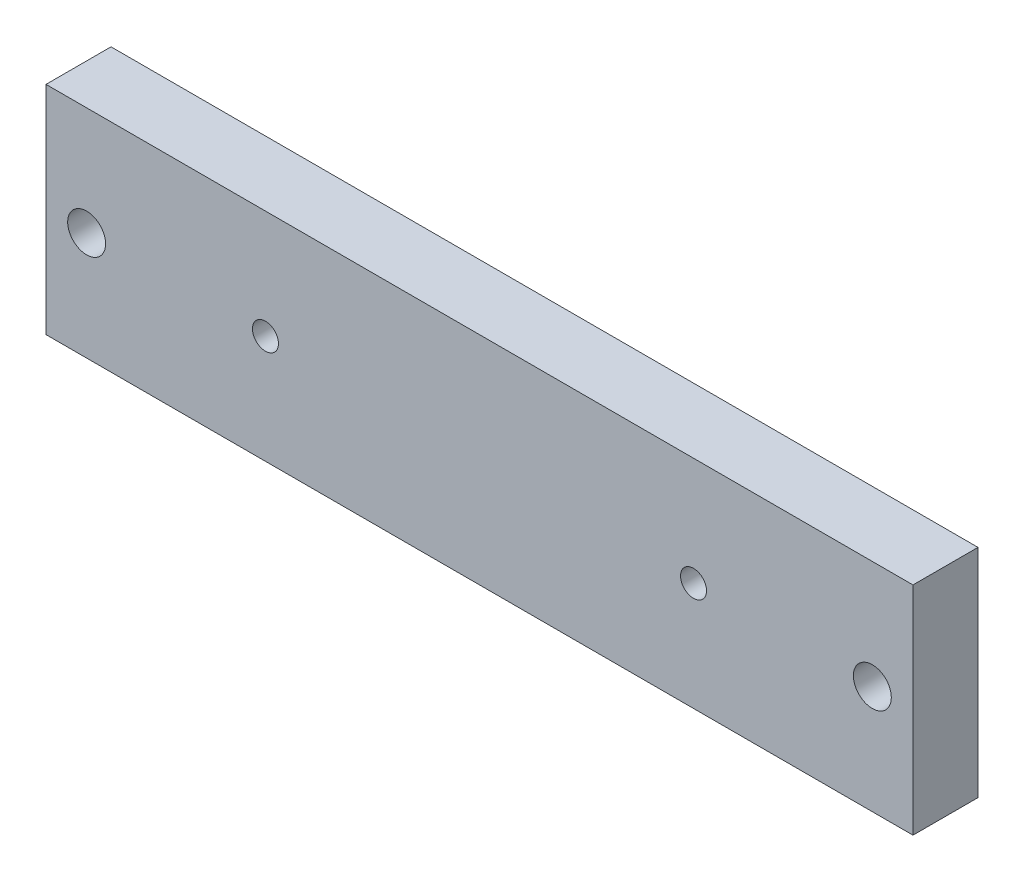
ISO-10303-21;
HEADER;
FILE_DESCRIPTION(('STEP AP214'),'2;1');
FILE_NAME('part.step','',(''),(''),'','','');
FILE_SCHEMA(('AUTOMOTIVE_DESIGN { 1 0 10303 214 1 1 1 1 }'));
ENDSEC;
DATA;
#1=APPLICATION_CONTEXT('core data for automotive mechanical design processes');
#2=APPLICATION_PROTOCOL_DEFINITION('international standard','automotive_design',2000,#1);
#3=PRODUCT_CONTEXT('',#1,'mechanical');
#4=PRODUCT('Part','Part','',(#3));
#5=PRODUCT_RELATED_PRODUCT_CATEGORY('part','',(#4));
#6=PRODUCT_DEFINITION_FORMATION('','',#4);
#7=PRODUCT_DEFINITION_CONTEXT('part definition',#1,'design');
#8=PRODUCT_DEFINITION('design','',#6,#7);
#9=PRODUCT_DEFINITION_SHAPE('','',#8);
#10=(LENGTH_UNIT() NAMED_UNIT(*) SI_UNIT(.MILLI.,.METRE.));
#11=(NAMED_UNIT(*) PLANE_ANGLE_UNIT() SI_UNIT($,.RADIAN.));
#12=(NAMED_UNIT(*) SI_UNIT($,.STERADIAN.) SOLID_ANGLE_UNIT());
#13=UNCERTAINTY_MEASURE_WITH_UNIT(LENGTH_MEASURE(1.E-05),#10,'distance_accuracy_value','');
#14=(GEOMETRIC_REPRESENTATION_CONTEXT(3) GLOBAL_UNCERTAINTY_ASSIGNED_CONTEXT((#13)) GLOBAL_UNIT_ASSIGNED_CONTEXT((#10,
#11,#12)) REPRESENTATION_CONTEXT('',''));
#15=CARTESIAN_POINT('',(0.,0.,0.));
#16=DIRECTION('',(0.,0.,1.));
#17=DIRECTION('',(1.,0.,0.));
#18=AXIS2_PLACEMENT_3D('',#15,#16,#17);
#19=CARTESIAN_POINT('',(80.,20.,12.));
#20=DIRECTION('',(-1.,0.,0.));
#21=DIRECTION('',(0.,0.,1.));
#22=AXIS2_PLACEMENT_3D('',#19,#20,#21);
#23=PLANE('',#22);
#24=DIRECTION('',(0.,1.,0.));
#25=VECTOR('',#24,1.);
#26=CARTESIAN_POINT('',(80.,20.,0.));
#27=LINE('',#26,#25);
#28=CARTESIAN_POINT('',(80.,-20.,0.));
#29=VERTEX_POINT('',#28);
#30=CARTESIAN_POINT('',(80.,20.,0.));
#31=VERTEX_POINT('',#30);
#32=EDGE_CURVE('E96',#29,#31,#27,.T.);
#33=ORIENTED_EDGE('',*,*,#32,.T.);
#34=DIRECTION('',(0.,0.,-1.));
#35=VECTOR('',#34,1.);
#36=CARTESIAN_POINT('',(80.,20.,12.));
#37=LINE('',#36,#35);
#38=CARTESIAN_POINT('',(80.,20.,12.));
#39=VERTEX_POINT('',#38);
#40=EDGE_CURVE('E11',#39,#31,#37,.T.);
#41=ORIENTED_EDGE('',*,*,#40,.F.);
#42=DIRECTION('',(0.,1.,0.));
#43=VECTOR('',#42,1.);
#44=CARTESIAN_POINT('',(80.,20.,12.));
#45=LINE('',#44,#43);
#46=CARTESIAN_POINT('',(80.,-20.,12.));
#47=VERTEX_POINT('',#46);
#48=EDGE_CURVE('E84',#47,#39,#45,.T.);
#49=ORIENTED_EDGE('',*,*,#48,.F.);
#50=DIRECTION('',(0.,0.,-1.));
#51=VECTOR('',#50,1.);
#52=CARTESIAN_POINT('',(80.,-20.,12.));
#53=LINE('',#52,#51);
#54=EDGE_CURVE('E92',#47,#29,#53,.T.);
#55=ORIENTED_EDGE('',*,*,#54,.T.);
#56=EDGE_LOOP('',(#33,#41,#49,#55));
#57=FACE_BOUND('',#56,.T.);
#58=ADVANCED_FACE('F33',(#57),#23,.F.);
#59=CARTESIAN_POINT('',(-80.,20.,12.));
#60=DIRECTION('',(0.,-1.,0.));
#61=DIRECTION('',(0.,0.,-1.));
#62=AXIS2_PLACEMENT_3D('',#59,#60,#61);
#63=PLANE('',#62);
#64=DIRECTION('',(-1.,0.,0.));
#65=VECTOR('',#64,1.);
#66=CARTESIAN_POINT('',(-80.,20.,0.));
#67=LINE('',#66,#65);
#68=CARTESIAN_POINT('',(-80.,20.,0.));
#69=VERTEX_POINT('',#68);
#70=EDGE_CURVE('E88',#31,#69,#67,.T.);
#71=ORIENTED_EDGE('',*,*,#70,.T.);
#72=DIRECTION('',(0.,0.,-1.));
#73=VECTOR('',#72,1.);
#74=CARTESIAN_POINT('',(-80.,20.,12.));
#75=LINE('',#74,#73);
#76=CARTESIAN_POINT('',(-80.,20.,12.));
#77=VERTEX_POINT('',#76);
#78=EDGE_CURVE('E41',#77,#69,#75,.T.);
#79=ORIENTED_EDGE('',*,*,#78,.F.);
#80=DIRECTION('',(-1.,0.,0.));
#81=VECTOR('',#80,1.);
#82=CARTESIAN_POINT('',(-80.,20.,12.));
#83=LINE('',#82,#81);
#84=EDGE_CURVE('E79',#39,#77,#83,.T.);
#85=ORIENTED_EDGE('',*,*,#84,.F.);
#86=ORIENTED_EDGE('',*,*,#40,.T.);
#87=EDGE_LOOP('',(#71,#79,#85,#86));
#88=FACE_BOUND('',#87,.T.);
#89=ADVANCED_FACE('F87',(#88),#63,.F.);
#90=CARTESIAN_POINT('',(-80.,20.,12.));
#91=DIRECTION('',(1.,0.,0.));
#92=DIRECTION('',(0.,0.,-1.));
#93=AXIS2_PLACEMENT_3D('',#90,#91,#92);
#94=PLANE('',#93);
#95=DIRECTION('',(0.,-1.,0.));
#96=VECTOR('',#95,1.);
#97=CARTESIAN_POINT('',(-80.,20.,0.));
#98=LINE('',#97,#96);
#99=CARTESIAN_POINT('',(-80.,-20.,0.));
#100=VERTEX_POINT('',#99);
#101=EDGE_CURVE('E66',#69,#100,#98,.T.);
#102=ORIENTED_EDGE('',*,*,#101,.T.);
#103=DIRECTION('',(0.,0.,-1.));
#104=VECTOR('',#103,1.);
#105=CARTESIAN_POINT('',(-80.,-20.,12.));
#106=LINE('',#105,#104);
#107=CARTESIAN_POINT('',(-80.,-20.,12.));
#108=VERTEX_POINT('',#107);
#109=EDGE_CURVE('E89',#108,#100,#106,.T.);
#110=ORIENTED_EDGE('',*,*,#109,.F.);
#111=DIRECTION('',(0.,-1.,0.));
#112=VECTOR('',#111,1.);
#113=CARTESIAN_POINT('',(-80.,20.,12.));
#114=LINE('',#113,#112);
#115=EDGE_CURVE('E82',#77,#108,#114,.T.);
#116=ORIENTED_EDGE('',*,*,#115,.F.);
#117=ORIENTED_EDGE('',*,*,#78,.T.);
#118=EDGE_LOOP('',(#102,#110,#116,#117));
#119=FACE_BOUND('',#118,.T.);
#120=ADVANCED_FACE('F90',(#119),#94,.F.);
#121=CARTESIAN_POINT('',(-80.,-20.,12.));
#122=DIRECTION('',(0.,1.,0.));
#123=DIRECTION('',(0.,0.,1.));
#124=AXIS2_PLACEMENT_3D('',#121,#122,#123);
#125=PLANE('',#124);
#126=DIRECTION('',(1.,0.,0.));
#127=VECTOR('',#126,1.);
#128=CARTESIAN_POINT('',(-80.,-20.,0.));
#129=LINE('',#128,#127);
#130=EDGE_CURVE('E72',#100,#29,#129,.T.);
#131=ORIENTED_EDGE('',*,*,#130,.T.);
#132=ORIENTED_EDGE('',*,*,#54,.F.);
#133=DIRECTION('',(1.,0.,0.));
#134=VECTOR('',#133,1.);
#135=CARTESIAN_POINT('',(-80.,-20.,12.));
#136=LINE('',#135,#134);
#137=EDGE_CURVE('E49',#108,#47,#136,.T.);
#138=ORIENTED_EDGE('',*,*,#137,.F.);
#139=ORIENTED_EDGE('',*,*,#109,.T.);
#140=EDGE_LOOP('',(#131,#132,#138,#139));
#141=FACE_BOUND('',#140,.T.);
#142=ADVANCED_FACE('F104',(#141),#125,.F.);
#143=CARTESIAN_POINT('',(0.,0.,12.));
#144=DIRECTION('',(0.,0.,1.));
#145=DIRECTION('',(1.,0.,0.));
#146=AXIS2_PLACEMENT_3D('',#143,#144,#145);
#147=PLANE('',#146);
#148=CARTESIAN_POINT('',(39.5,0.,12.));
#149=DIRECTION('',(0.,0.,-1.));
#150=DIRECTION('',(-1.,0.,0.));
#151=AXIS2_PLACEMENT_3D('',#148,#149,#150);
#152=CIRCLE('',#151,2.4);
#153=CARTESIAN_POINT('',(37.1,0.,12.));
#154=VERTEX_POINT('',#153);
#155=EDGE_CURVE('E133',#154,#154,#152,.T.);
#156=ORIENTED_EDGE('',*,*,#155,.T.);
#157=EDGE_LOOP('',(#156));
#158=FACE_BOUND('',#157,.T.);
#159=CARTESIAN_POINT('',(-39.5,0.,12.));
#160=DIRECTION('',(0.,0.,-1.));
#161=DIRECTION('',(-1.,0.,0.));
#162=AXIS2_PLACEMENT_3D('',#159,#160,#161);
#163=CIRCLE('',#162,2.4);
#164=CARTESIAN_POINT('',(-41.9,0.,12.));
#165=VERTEX_POINT('',#164);
#166=EDGE_CURVE('E121',#165,#165,#163,.T.);
#167=ORIENTED_EDGE('',*,*,#166,.T.);
#168=EDGE_LOOP('',(#167));
#169=FACE_BOUND('',#168,.T.);
#170=CARTESIAN_POINT('',(-72.5,0.,12.));
#171=DIRECTION('',(0.,0.,1.));
#172=DIRECTION('',(1.,0.,0.));
#173=AXIS2_PLACEMENT_3D('',#170,#171,#172);
#174=CIRCLE('',#173,3.49999999999999);
#175=CARTESIAN_POINT('',(-69.,0.,12.));
#176=VERTEX_POINT('',#175);
#177=EDGE_CURVE('E118',#176,#176,#174,.T.);
#178=ORIENTED_EDGE('',*,*,#177,.F.);
#179=EDGE_LOOP('',(#178));
#180=FACE_BOUND('',#179,.T.);
#181=CARTESIAN_POINT('',(72.5,0.,12.));
#182=DIRECTION('',(0.,0.,1.));
#183=DIRECTION('',(1.,0.,0.));
#184=AXIS2_PLACEMENT_3D('',#181,#182,#183);
#185=CIRCLE('',#184,3.49999999999999);
#186=CARTESIAN_POINT('',(76.,0.,12.));
#187=VERTEX_POINT('',#186);
#188=EDGE_CURVE('E112',#187,#187,#185,.T.);
#189=ORIENTED_EDGE('',*,*,#188,.F.);
#190=EDGE_LOOP('',(#189));
#191=FACE_BOUND('',#190,.T.);
#192=ORIENTED_EDGE('',*,*,#48,.T.);
#193=ORIENTED_EDGE('',*,*,#84,.T.);
#194=ORIENTED_EDGE('',*,*,#115,.T.);
#195=ORIENTED_EDGE('',*,*,#137,.T.);
#196=EDGE_LOOP('',(#192,#193,#194,#195));
#197=FACE_BOUND('',#196,.T.);
#198=ADVANCED_FACE('F80',(#158,#169,#180,#191,#197),#147,.T.);
#199=CARTESIAN_POINT('',(0.,0.,0.));
#200=DIRECTION('',(0.,0.,1.));
#201=DIRECTION('',(1.,0.,0.));
#202=AXIS2_PLACEMENT_3D('',#199,#200,#201);
#203=PLANE('',#202);
#204=CARTESIAN_POINT('',(39.5,0.,0.));
#205=DIRECTION('',(0.,0.,-1.));
#206=DIRECTION('',(-1.,0.,0.));
#207=AXIS2_PLACEMENT_3D('',#204,#205,#206);
#208=CIRCLE('',#207,4.);
#209=CARTESIAN_POINT('',(35.5,0.,0.));
#210=VERTEX_POINT('',#209);
#211=EDGE_CURVE('E142',#210,#210,#208,.T.);
#212=ORIENTED_EDGE('',*,*,#211,.F.);
#213=EDGE_LOOP('',(#212));
#214=FACE_BOUND('',#213,.T.);
#215=CARTESIAN_POINT('',(-39.5,0.,0.));
#216=DIRECTION('',(0.,0.,-1.));
#217=DIRECTION('',(-1.,0.,0.));
#218=AXIS2_PLACEMENT_3D('',#215,#216,#217);
#219=CIRCLE('',#218,4.);
#220=CARTESIAN_POINT('',(-43.5,0.,0.));
#221=VERTEX_POINT('',#220);
#222=EDGE_CURVE('E130',#221,#221,#219,.T.);
#223=ORIENTED_EDGE('',*,*,#222,.F.);
#224=EDGE_LOOP('',(#223));
#225=FACE_BOUND('',#224,.T.);
#226=CARTESIAN_POINT('',(-72.5,0.,0.));
#227=DIRECTION('',(0.,0.,1.));
#228=DIRECTION('',(1.,0.,0.));
#229=AXIS2_PLACEMENT_3D('',#226,#227,#228);
#230=CIRCLE('',#229,3.5);
#231=CARTESIAN_POINT('',(-69.,0.,0.));
#232=VERTEX_POINT('',#231);
#233=EDGE_CURVE('E115',#232,#232,#230,.T.);
#234=ORIENTED_EDGE('',*,*,#233,.T.);
#235=EDGE_LOOP('',(#234));
#236=FACE_BOUND('',#235,.T.);
#237=CARTESIAN_POINT('',(72.5,0.,0.));
#238=DIRECTION('',(0.,0.,1.));
#239=DIRECTION('',(1.,0.,0.));
#240=AXIS2_PLACEMENT_3D('',#237,#238,#239);
#241=CIRCLE('',#240,3.5);
#242=CARTESIAN_POINT('',(76.,0.,0.));
#243=VERTEX_POINT('',#242);
#244=EDGE_CURVE('E99',#243,#243,#241,.T.);
#245=ORIENTED_EDGE('',*,*,#244,.T.);
#246=EDGE_LOOP('',(#245));
#247=FACE_BOUND('',#246,.T.);
#248=ORIENTED_EDGE('',*,*,#32,.F.);
#249=ORIENTED_EDGE('',*,*,#130,.F.);
#250=ORIENTED_EDGE('',*,*,#101,.F.);
#251=ORIENTED_EDGE('',*,*,#70,.F.);
#252=EDGE_LOOP('',(#248,#249,#250,#251));
#253=FACE_BOUND('',#252,.T.);
#254=ADVANCED_FACE('F107',(#214,#225,#236,#247,#253),#203,.F.);
#255=CARTESIAN_POINT('',(72.5,0.,12.));
#256=DIRECTION('',(0.,0.,1.));
#257=DIRECTION('',(1.,0.,0.));
#258=AXIS2_PLACEMENT_3D('',#255,#256,#257);
#259=CYLINDRICAL_SURFACE('',#258,3.5);
#260=ORIENTED_EDGE('',*,*,#244,.F.);
#261=EDGE_LOOP('',(#260));
#262=FACE_BOUND('',#261,.T.);
#263=ORIENTED_EDGE('',*,*,#188,.T.);
#264=EDGE_LOOP('',(#263));
#265=FACE_BOUND('',#264,.T.);
#266=ADVANCED_FACE('F150',(#262,#265),#259,.F.);
#267=CARTESIAN_POINT('',(-72.5,0.,12.));
#268=DIRECTION('',(0.,0.,1.));
#269=DIRECTION('',(1.,0.,0.));
#270=AXIS2_PLACEMENT_3D('',#267,#268,#269);
#271=CYLINDRICAL_SURFACE('',#270,3.5);
#272=ORIENTED_EDGE('',*,*,#233,.F.);
#273=EDGE_LOOP('',(#272));
#274=FACE_BOUND('',#273,.T.);
#275=ORIENTED_EDGE('',*,*,#177,.T.);
#276=EDGE_LOOP('',(#275));
#277=FACE_BOUND('',#276,.T.);
#278=ADVANCED_FACE('F160',(#274,#277),#271,.F.);
#279=CARTESIAN_POINT('',(-39.5,0.,0.));
#280=DIRECTION('',(0.,0.,-1.));
#281=DIRECTION('',(-1.,0.,0.));
#282=AXIS2_PLACEMENT_3D('',#279,#280,#281);
#283=CYLINDRICAL_SURFACE('',#282,2.4);
#284=ORIENTED_EDGE('',*,*,#166,.F.);
#285=EDGE_LOOP('',(#284));
#286=FACE_BOUND('',#285,.T.);
#287=CARTESIAN_POINT('',(-39.5,0.,4.));
#288=DIRECTION('',(0.,0.,-1.));
#289=DIRECTION('',(-1.,0.,0.));
#290=AXIS2_PLACEMENT_3D('',#287,#288,#289);
#291=CIRCLE('',#290,2.4);
#292=CARTESIAN_POINT('',(-41.9,0.,4.));
#293=VERTEX_POINT('',#292);
#294=EDGE_CURVE('E124',#293,#293,#291,.T.);
#295=ORIENTED_EDGE('',*,*,#294,.T.);
#296=EDGE_LOOP('',(#295));
#297=FACE_BOUND('',#296,.T.);
#298=ADVANCED_FACE('F207',(#286,#297),#283,.F.);
#299=CARTESIAN_POINT('',(-37.1,0.,4.));
#300=DIRECTION('',(0.,0.,1.));
#301=DIRECTION('',(1.,0.,0.));
#302=AXIS2_PLACEMENT_3D('',#299,#300,#301);
#303=PLANE('',#302);
#304=ORIENTED_EDGE('',*,*,#294,.F.);
#305=EDGE_LOOP('',(#304));
#306=FACE_BOUND('',#305,.T.);
#307=CARTESIAN_POINT('',(-39.5,0.,4.));
#308=DIRECTION('',(0.,0.,-1.));
#309=DIRECTION('',(-1.,0.,0.));
#310=AXIS2_PLACEMENT_3D('',#307,#308,#309);
#311=CIRCLE('',#310,4.);
#312=CARTESIAN_POINT('',(-43.5,0.,4.));
#313=VERTEX_POINT('',#312);
#314=EDGE_CURVE('E127',#313,#313,#311,.T.);
#315=ORIENTED_EDGE('',*,*,#314,.T.);
#316=EDGE_LOOP('',(#315));
#317=FACE_BOUND('',#316,.T.);
#318=ADVANCED_FACE('F214',(#306,#317),#303,.F.);
#319=CARTESIAN_POINT('',(-39.5,0.,0.));
#320=DIRECTION('',(0.,0.,-1.));
#321=DIRECTION('',(-1.,0.,0.));
#322=AXIS2_PLACEMENT_3D('',#319,#320,#321);
#323=CYLINDRICAL_SURFACE('',#322,4.);
#324=ORIENTED_EDGE('',*,*,#314,.F.);
#325=EDGE_LOOP('',(#324));
#326=FACE_BOUND('',#325,.T.);
#327=ORIENTED_EDGE('',*,*,#222,.T.);
#328=EDGE_LOOP('',(#327));
#329=FACE_BOUND('',#328,.T.);
#330=ADVANCED_FACE('F222',(#326,#329),#323,.F.);
#331=CARTESIAN_POINT('',(39.5,0.,0.));
#332=DIRECTION('',(0.,0.,-1.));
#333=DIRECTION('',(-1.,0.,0.));
#334=AXIS2_PLACEMENT_3D('',#331,#332,#333);
#335=CYLINDRICAL_SURFACE('',#334,2.4);
#336=ORIENTED_EDGE('',*,*,#155,.F.);
#337=EDGE_LOOP('',(#336));
#338=FACE_BOUND('',#337,.T.);
#339=CARTESIAN_POINT('',(39.5,0.,4.));
#340=DIRECTION('',(0.,0.,-1.));
#341=DIRECTION('',(-1.,0.,0.));
#342=AXIS2_PLACEMENT_3D('',#339,#340,#341);
#343=CIRCLE('',#342,2.4);
#344=CARTESIAN_POINT('',(37.1,0.,4.));
#345=VERTEX_POINT('',#344);
#346=EDGE_CURVE('E136',#345,#345,#343,.T.);
#347=ORIENTED_EDGE('',*,*,#346,.T.);
#348=EDGE_LOOP('',(#347));
#349=FACE_BOUND('',#348,.T.);
#350=ADVANCED_FACE('F230',(#338,#349),#335,.F.);
#351=CARTESIAN_POINT('',(41.9,0.,4.));
#352=DIRECTION('',(0.,0.,1.));
#353=DIRECTION('',(1.,0.,0.));
#354=AXIS2_PLACEMENT_3D('',#351,#352,#353);
#355=PLANE('',#354);
#356=ORIENTED_EDGE('',*,*,#346,.F.);
#357=EDGE_LOOP('',(#356));
#358=FACE_BOUND('',#357,.T.);
#359=CARTESIAN_POINT('',(39.5,0.,4.));
#360=DIRECTION('',(0.,0.,-1.));
#361=DIRECTION('',(-1.,0.,0.));
#362=AXIS2_PLACEMENT_3D('',#359,#360,#361);
#363=CIRCLE('',#362,4.);
#364=CARTESIAN_POINT('',(35.5,0.,4.));
#365=VERTEX_POINT('',#364);
#366=EDGE_CURVE('E139',#365,#365,#363,.T.);
#367=ORIENTED_EDGE('',*,*,#366,.T.);
#368=EDGE_LOOP('',(#367));
#369=FACE_BOUND('',#368,.T.);
#370=ADVANCED_FACE('F238',(#358,#369),#355,.F.);
#371=CARTESIAN_POINT('',(39.5,0.,0.));
#372=DIRECTION('',(0.,0.,-1.));
#373=DIRECTION('',(-1.,0.,0.));
#374=AXIS2_PLACEMENT_3D('',#371,#372,#373);
#375=CYLINDRICAL_SURFACE('',#374,4.);
#376=ORIENTED_EDGE('',*,*,#366,.F.);
#377=EDGE_LOOP('',(#376));
#378=FACE_BOUND('',#377,.T.);
#379=ORIENTED_EDGE('',*,*,#211,.T.);
#380=EDGE_LOOP('',(#379));
#381=FACE_BOUND('',#380,.T.);
#382=ADVANCED_FACE('F146',(#378,#381),#375,.F.);
#383=CLOSED_SHELL('',(#58,#89,#120,#142,#198,#254,#266,#278,#298,#318,#330,#350,#370,#382));
#384=MANIFOLD_SOLID_BREP('B2',#383);
#385=ADVANCED_BREP_SHAPE_REPRESENTATION('',(#18,#384),#14);
#386=SHAPE_DEFINITION_REPRESENTATION(#9,#385);
ENDSEC;
END-ISO-10303-21;
